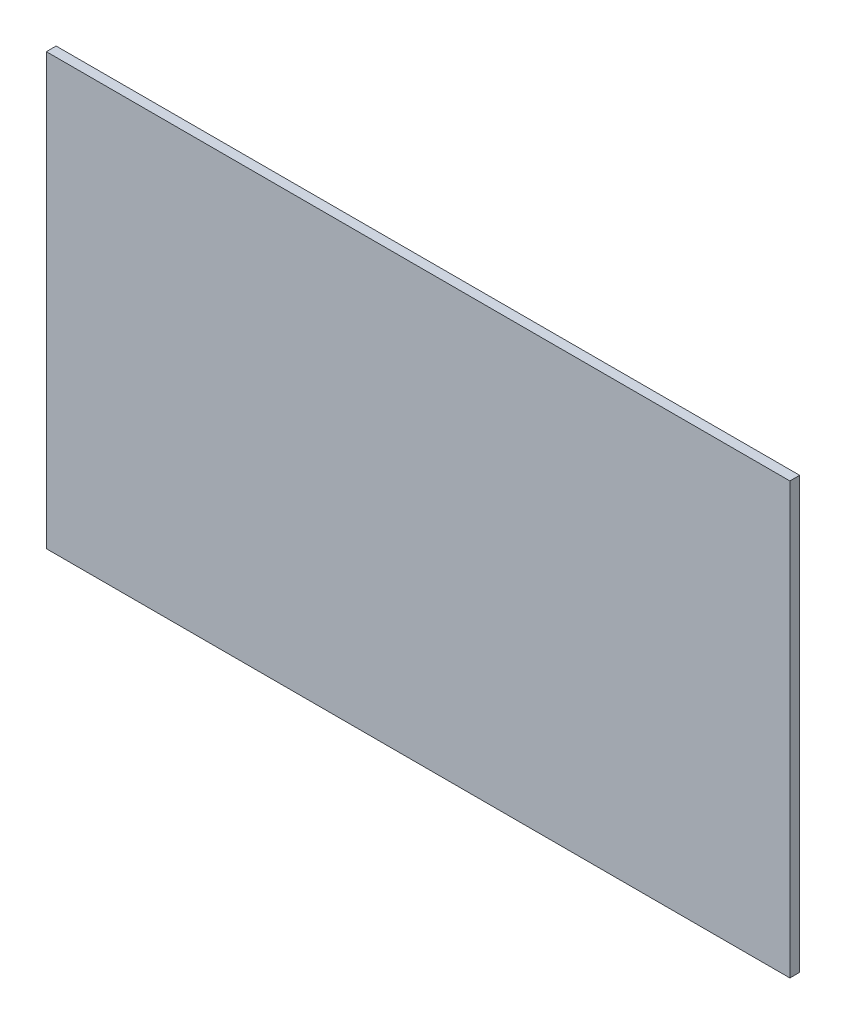
ISO-10303-21;
HEADER;
FILE_DESCRIPTION(('STEP AP214'),'2;1');
FILE_NAME('part.step','',(''),(''),'','','');
FILE_SCHEMA(('AUTOMOTIVE_DESIGN { 1 0 10303 214 1 1 1 1 }'));
ENDSEC;
DATA;
#1=APPLICATION_CONTEXT('core data for automotive mechanical design processes');
#2=APPLICATION_PROTOCOL_DEFINITION('international standard','automotive_design',2000,#1);
#3=PRODUCT_CONTEXT('',#1,'mechanical');
#4=PRODUCT('Part','Part','',(#3));
#5=PRODUCT_RELATED_PRODUCT_CATEGORY('part','',(#4));
#6=PRODUCT_DEFINITION_FORMATION('','',#4);
#7=PRODUCT_DEFINITION_CONTEXT('part definition',#1,'design');
#8=PRODUCT_DEFINITION('design','',#6,#7);
#9=PRODUCT_DEFINITION_SHAPE('','',#8);
#10=(LENGTH_UNIT() NAMED_UNIT(*) SI_UNIT(.MILLI.,.METRE.));
#11=(NAMED_UNIT(*) PLANE_ANGLE_UNIT() SI_UNIT($,.RADIAN.));
#12=(NAMED_UNIT(*) SI_UNIT($,.STERADIAN.) SOLID_ANGLE_UNIT());
#13=UNCERTAINTY_MEASURE_WITH_UNIT(LENGTH_MEASURE(1.E-05),#10,'distance_accuracy_value','');
#14=(GEOMETRIC_REPRESENTATION_CONTEXT(3) GLOBAL_UNCERTAINTY_ASSIGNED_CONTEXT((#13)) GLOBAL_UNIT_ASSIGNED_CONTEXT((#10,
#11,#12)) REPRESENTATION_CONTEXT('',''));
#15=CARTESIAN_POINT('',(0.,0.,0.));
#16=DIRECTION('',(0.,0.,1.));
#17=DIRECTION('',(1.,0.,0.));
#18=AXIS2_PLACEMENT_3D('',#15,#16,#17);
#19=CARTESIAN_POINT('',(-189.657256386785,78.6928934010153,5.));
#20=DIRECTION('',(1.,0.,0.));
#21=DIRECTION('',(0.,0.,-1.));
#22=AXIS2_PLACEMENT_3D('',#19,#20,#21);
#23=PLANE('',#22);
#24=DIRECTION('',(0.,-1.,0.));
#25=VECTOR('',#24,1.);
#26=CARTESIAN_POINT('',(-189.657256386785,78.6928934010153,0.));
#27=LINE('',#26,#25);
#28=CARTESIAN_POINT('',(-189.657256386785,78.6928934010153,0.));
#29=VERTEX_POINT('',#28);
#30=CARTESIAN_POINT('',(-189.657256386785,-141.307106598985,0.));
#31=VERTEX_POINT('',#30);
#32=EDGE_CURVE('E96',#29,#31,#27,.T.);
#33=ORIENTED_EDGE('',*,*,#32,.T.);
#34=DIRECTION('',(0.,0.,-1.));
#35=VECTOR('',#34,1.);
#36=CARTESIAN_POINT('',(-189.657256386785,-141.307106598985,5.));
#37=LINE('',#36,#35);
#38=CARTESIAN_POINT('',(-189.657256386785,-141.307106598985,5.));
#39=VERTEX_POINT('',#38);
#40=EDGE_CURVE('E11',#39,#31,#37,.T.);
#41=ORIENTED_EDGE('',*,*,#40,.F.);
#42=DIRECTION('',(0.,-1.,0.));
#43=VECTOR('',#42,1.);
#44=CARTESIAN_POINT('',(-189.657256386785,78.6928934010153,5.));
#45=LINE('',#44,#43);
#46=CARTESIAN_POINT('',(-189.657256386785,78.6928934010153,5.));
#47=VERTEX_POINT('',#46);
#48=EDGE_CURVE('E84',#47,#39,#45,.T.);
#49=ORIENTED_EDGE('',*,*,#48,.F.);
#50=DIRECTION('',(0.,0.,-1.));
#51=VECTOR('',#50,1.);
#52=CARTESIAN_POINT('',(-189.657256386785,78.6928934010153,5.));
#53=LINE('',#52,#51);
#54=EDGE_CURVE('E92',#47,#29,#53,.T.);
#55=ORIENTED_EDGE('',*,*,#54,.T.);
#56=EDGE_LOOP('',(#33,#41,#49,#55));
#57=FACE_BOUND('',#56,.T.);
#58=ADVANCED_FACE('F33',(#57),#23,.F.);
#59=CARTESIAN_POINT('',(-189.657256386785,-141.307106598985,5.));
#60=DIRECTION('',(0.,1.,0.));
#61=DIRECTION('',(0.,0.,1.));
#62=AXIS2_PLACEMENT_3D('',#59,#60,#61);
#63=PLANE('',#62);
#64=DIRECTION('',(1.,0.,0.));
#65=VECTOR('',#64,1.);
#66=CARTESIAN_POINT('',(-189.657256386785,-141.307106598985,0.));
#67=LINE('',#66,#65);
#68=CARTESIAN_POINT('',(190.342743613215,-141.307106598985,0.));
#69=VERTEX_POINT('',#68);
#70=EDGE_CURVE('E88',#31,#69,#67,.T.);
#71=ORIENTED_EDGE('',*,*,#70,.T.);
#72=DIRECTION('',(0.,0.,-1.));
#73=VECTOR('',#72,1.);
#74=CARTESIAN_POINT('',(190.342743613215,-141.307106598985,5.));
#75=LINE('',#74,#73);
#76=CARTESIAN_POINT('',(190.342743613215,-141.307106598985,5.));
#77=VERTEX_POINT('',#76);
#78=EDGE_CURVE('E41',#77,#69,#75,.T.);
#79=ORIENTED_EDGE('',*,*,#78,.F.);
#80=DIRECTION('',(1.,0.,0.));
#81=VECTOR('',#80,1.);
#82=CARTESIAN_POINT('',(-189.657256386785,-141.307106598985,5.));
#83=LINE('',#82,#81);
#84=EDGE_CURVE('E79',#39,#77,#83,.T.);
#85=ORIENTED_EDGE('',*,*,#84,.F.);
#86=ORIENTED_EDGE('',*,*,#40,.T.);
#87=EDGE_LOOP('',(#71,#79,#85,#86));
#88=FACE_BOUND('',#87,.T.);
#89=ADVANCED_FACE('F87',(#88),#63,.F.);
#90=CARTESIAN_POINT('',(190.342743613215,78.6928934010153,5.));
#91=DIRECTION('',(-1.,0.,0.));
#92=DIRECTION('',(0.,0.,1.));
#93=AXIS2_PLACEMENT_3D('',#90,#91,#92);
#94=PLANE('',#93);
#95=DIRECTION('',(0.,1.,0.));
#96=VECTOR('',#95,1.);
#97=CARTESIAN_POINT('',(190.342743613215,78.6928934010153,0.));
#98=LINE('',#97,#96);
#99=CARTESIAN_POINT('',(190.342743613215,78.6928934010153,0.));
#100=VERTEX_POINT('',#99);
#101=EDGE_CURVE('E66',#69,#100,#98,.T.);
#102=ORIENTED_EDGE('',*,*,#101,.T.);
#103=DIRECTION('',(0.,0.,-1.));
#104=VECTOR('',#103,1.);
#105=CARTESIAN_POINT('',(190.342743613215,78.6928934010153,5.));
#106=LINE('',#105,#104);
#107=CARTESIAN_POINT('',(190.342743613215,78.6928934010153,5.));
#108=VERTEX_POINT('',#107);
#109=EDGE_CURVE('E89',#108,#100,#106,.T.);
#110=ORIENTED_EDGE('',*,*,#109,.F.);
#111=DIRECTION('',(0.,1.,0.));
#112=VECTOR('',#111,1.);
#113=CARTESIAN_POINT('',(190.342743613215,78.6928934010153,5.));
#114=LINE('',#113,#112);
#115=EDGE_CURVE('E82',#77,#108,#114,.T.);
#116=ORIENTED_EDGE('',*,*,#115,.F.);
#117=ORIENTED_EDGE('',*,*,#78,.T.);
#118=EDGE_LOOP('',(#102,#110,#116,#117));
#119=FACE_BOUND('',#118,.T.);
#120=ADVANCED_FACE('F90',(#119),#94,.F.);
#121=CARTESIAN_POINT('',(-189.657256386785,78.6928934010153,5.));
#122=DIRECTION('',(0.,-1.,0.));
#123=DIRECTION('',(0.,0.,-1.));
#124=AXIS2_PLACEMENT_3D('',#121,#122,#123);
#125=PLANE('',#124);
#126=DIRECTION('',(-1.,0.,0.));
#127=VECTOR('',#126,1.);
#128=CARTESIAN_POINT('',(-189.657256386785,78.6928934010153,0.));
#129=LINE('',#128,#127);
#130=EDGE_CURVE('E72',#100,#29,#129,.T.);
#131=ORIENTED_EDGE('',*,*,#130,.T.);
#132=ORIENTED_EDGE('',*,*,#54,.F.);
#133=DIRECTION('',(-1.,0.,0.));
#134=VECTOR('',#133,1.);
#135=CARTESIAN_POINT('',(-189.657256386785,78.6928934010153,5.));
#136=LINE('',#135,#134);
#137=EDGE_CURVE('E49',#108,#47,#136,.T.);
#138=ORIENTED_EDGE('',*,*,#137,.F.);
#139=ORIENTED_EDGE('',*,*,#109,.T.);
#140=EDGE_LOOP('',(#131,#132,#138,#139));
#141=FACE_BOUND('',#140,.T.);
#142=ADVANCED_FACE('F103',(#141),#125,.F.);
#143=CARTESIAN_POINT('',(0.,0.,5.));
#144=DIRECTION('',(0.,0.,1.));
#145=DIRECTION('',(1.,0.,0.));
#146=AXIS2_PLACEMENT_3D('',#143,#144,#145);
#147=PLANE('',#146);
#148=ORIENTED_EDGE('',*,*,#48,.T.);
#149=ORIENTED_EDGE('',*,*,#84,.T.);
#150=ORIENTED_EDGE('',*,*,#115,.T.);
#151=ORIENTED_EDGE('',*,*,#137,.T.);
#152=EDGE_LOOP('',(#148,#149,#150,#151));
#153=FACE_BOUND('',#152,.T.);
#154=ADVANCED_FACE('F80',(#153),#147,.T.);
#155=CARTESIAN_POINT('',(0.,0.,0.));
#156=DIRECTION('',(0.,0.,1.));
#157=DIRECTION('',(1.,0.,0.));
#158=AXIS2_PLACEMENT_3D('',#155,#156,#157);
#159=PLANE('',#158);
#160=ORIENTED_EDGE('',*,*,#32,.F.);
#161=ORIENTED_EDGE('',*,*,#130,.F.);
#162=ORIENTED_EDGE('',*,*,#101,.F.);
#163=ORIENTED_EDGE('',*,*,#70,.F.);
#164=EDGE_LOOP('',(#160,#161,#162,#163));
#165=FACE_BOUND('',#164,.T.);
#166=ADVANCED_FACE('F106',(#165),#159,.F.);
#167=CLOSED_SHELL('',(#58,#89,#120,#142,#154,#166));
#168=MANIFOLD_SOLID_BREP('B2',#167);
#169=ADVANCED_BREP_SHAPE_REPRESENTATION('',(#18,#168),#14);
#170=SHAPE_DEFINITION_REPRESENTATION(#9,#169);
ENDSEC;
END-ISO-10303-21;
